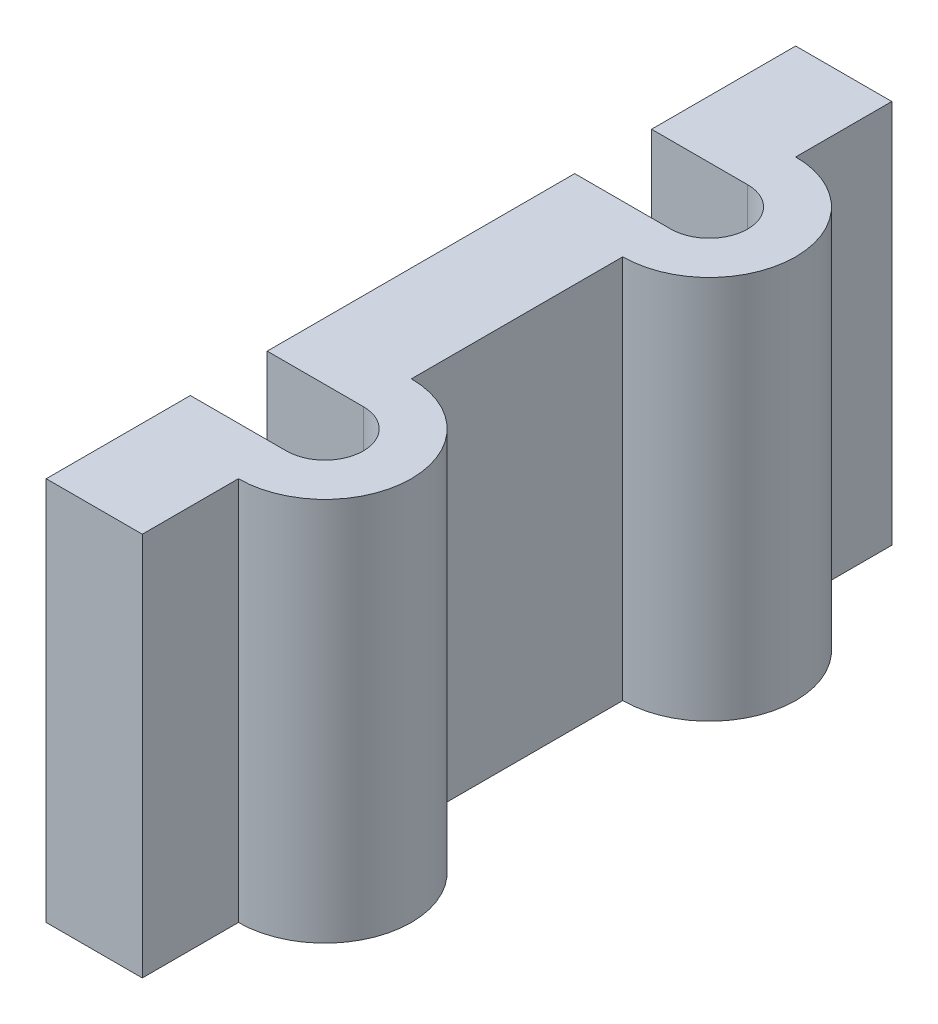
ISO-10303-21;
HEADER;
FILE_DESCRIPTION(('STEP AP214'),'2;1');
FILE_NAME('part.step','',(''),(''),'','','');
FILE_SCHEMA(('AUTOMOTIVE_DESIGN { 1 0 10303 214 1 1 1 1 }'));
ENDSEC;
DATA;
#1=APPLICATION_CONTEXT('core data for automotive mechanical design processes');
#2=APPLICATION_PROTOCOL_DEFINITION('international standard','automotive_design',2000,#1);
#3=PRODUCT_CONTEXT('',#1,'mechanical');
#4=PRODUCT('Part','Part','',(#3));
#5=PRODUCT_RELATED_PRODUCT_CATEGORY('part','',(#4));
#6=PRODUCT_DEFINITION_FORMATION('','',#4);
#7=PRODUCT_DEFINITION_CONTEXT('part definition',#1,'design');
#8=PRODUCT_DEFINITION('design','',#6,#7);
#9=PRODUCT_DEFINITION_SHAPE('','',#8);
#10=(LENGTH_UNIT() NAMED_UNIT(*) SI_UNIT(.MILLI.,.METRE.));
#11=(NAMED_UNIT(*) PLANE_ANGLE_UNIT() SI_UNIT($,.RADIAN.));
#12=(NAMED_UNIT(*) SI_UNIT($,.STERADIAN.) SOLID_ANGLE_UNIT());
#13=UNCERTAINTY_MEASURE_WITH_UNIT(LENGTH_MEASURE(1.E-05),#10,'distance_accuracy_value','');
#14=(GEOMETRIC_REPRESENTATION_CONTEXT(3) GLOBAL_UNCERTAINTY_ASSIGNED_CONTEXT((#13)) GLOBAL_UNIT_ASSIGNED_CONTEXT((#10,
#11,#12)) REPRESENTATION_CONTEXT('',''));
#15=CARTESIAN_POINT('',(0.,0.,0.));
#16=DIRECTION('',(0.,0.,1.));
#17=DIRECTION('',(1.,0.,0.));
#18=AXIS2_PLACEMENT_3D('',#15,#16,#17);
#19=CARTESIAN_POINT('',(0.,40.,0.));
#20=DIRECTION('',(0.,0.,-1.));
#21=DIRECTION('',(-1.,0.,0.));
#22=AXIS2_PLACEMENT_3D('',#19,#20,#21);
#23=PLANE('',#22);
#24=DIRECTION('',(1.,0.,0.));
#25=VECTOR('',#24,1.);
#26=CARTESIAN_POINT('',(0.,0.,0.));
#27=LINE('',#26,#25);
#28=CARTESIAN_POINT('',(0.,0.,0.));
#29=VERTEX_POINT('',#28);
#30=CARTESIAN_POINT('',(10.,0.,0.));
#31=VERTEX_POINT('',#30);
#32=EDGE_CURVE('E179',#29,#31,#27,.T.);
#33=ORIENTED_EDGE('',*,*,#32,.T.);
#34=DIRECTION('',(0.,-1.,0.));
#35=VECTOR('',#34,1.);
#36=CARTESIAN_POINT('',(10.,40.,0.));
#37=LINE('',#36,#35);
#38=CARTESIAN_POINT('',(10.,40.,0.));
#39=VERTEX_POINT('',#38);
#40=EDGE_CURVE('E11',#39,#31,#37,.T.);
#41=ORIENTED_EDGE('',*,*,#40,.F.);
#42=DIRECTION('',(1.,0.,0.));
#43=VECTOR('',#42,1.);
#44=CARTESIAN_POINT('',(0.,40.,0.));
#45=LINE('',#44,#43);
#46=CARTESIAN_POINT('',(0.,40.,0.));
#47=VERTEX_POINT('',#46);
#48=EDGE_CURVE('E209',#47,#39,#45,.T.);
#49=ORIENTED_EDGE('',*,*,#48,.F.);
#50=DIRECTION('',(0.,-1.,0.));
#51=VECTOR('',#50,1.);
#52=CARTESIAN_POINT('',(0.,40.,0.));
#53=LINE('',#52,#51);
#54=EDGE_CURVE('E175',#47,#29,#53,.T.);
#55=ORIENTED_EDGE('',*,*,#54,.T.);
#56=EDGE_LOOP('',(#33,#41,#49,#55));
#57=FACE_BOUND('',#56,.T.);
#58=ADVANCED_FACE('F35',(#57),#23,.F.);
#59=CARTESIAN_POINT('',(10.,40.,0.));
#60=DIRECTION('',(-1.,0.,0.));
#61=DIRECTION('',(0.,0.,1.));
#62=AXIS2_PLACEMENT_3D('',#59,#60,#61);
#63=PLANE('',#62);
#64=DIRECTION('',(0.,0.,-1.));
#65=VECTOR('',#64,1.);
#66=CARTESIAN_POINT('',(10.,0.,0.));
#67=LINE('',#66,#65);
#68=CARTESIAN_POINT('',(10.,0.,-10.));
#69=VERTEX_POINT('',#68);
#70=EDGE_CURVE('E182',#31,#69,#67,.T.);
#71=ORIENTED_EDGE('',*,*,#70,.T.);
#72=DIRECTION('',(0.,-1.,0.));
#73=VECTOR('',#72,1.);
#74=CARTESIAN_POINT('',(10.,40.,-10.));
#75=LINE('',#74,#73);
#76=CARTESIAN_POINT('',(10.,40.,-10.));
#77=VERTEX_POINT('',#76);
#78=EDGE_CURVE('E43',#77,#69,#75,.T.);
#79=ORIENTED_EDGE('',*,*,#78,.F.);
#80=DIRECTION('',(0.,0.,-1.));
#81=VECTOR('',#80,1.);
#82=CARTESIAN_POINT('',(10.,40.,0.));
#83=LINE('',#82,#81);
#84=EDGE_CURVE('E118',#39,#77,#83,.T.);
#85=ORIENTED_EDGE('',*,*,#84,.F.);
#86=ORIENTED_EDGE('',*,*,#40,.T.);
#87=EDGE_LOOP('',(#71,#79,#85,#86));
#88=FACE_BOUND('',#87,.T.);
#89=ADVANCED_FACE('F307',(#88),#63,.F.);
#90=CARTESIAN_POINT('',(10.,40.,-19.));
#91=DIRECTION('',(0.,-1.,0.));
#92=DIRECTION('',(0.,0.,-1.));
#93=AXIS2_PLACEMENT_3D('',#90,#91,#92);
#94=CYLINDRICAL_SURFACE('',#93,9.);
#95=CARTESIAN_POINT('',(10.,0.,-19.));
#96=DIRECTION('',(0.,1.,0.));
#97=DIRECTION('',(0.,0.,1.));
#98=AXIS2_PLACEMENT_3D('',#95,#96,#97);
#99=CIRCLE('',#98,9.);
#100=CARTESIAN_POINT('',(10.,0.,-28.));
#101=VERTEX_POINT('',#100);
#102=EDGE_CURVE('E184',#69,#101,#99,.T.);
#103=ORIENTED_EDGE('',*,*,#102,.T.);
#104=DIRECTION('',(0.,-1.,0.));
#105=VECTOR('',#104,1.);
#106=CARTESIAN_POINT('',(10.,40.,-28.));
#107=LINE('',#106,#105);
#108=CARTESIAN_POINT('',(10.,40.,-28.));
#109=VERTEX_POINT('',#108);
#110=EDGE_CURVE('E240',#109,#101,#107,.T.);
#111=ORIENTED_EDGE('',*,*,#110,.F.);
#112=CARTESIAN_POINT('',(10.,40.,-19.));
#113=DIRECTION('',(0.,1.,0.));
#114=DIRECTION('',(0.,0.,1.));
#115=AXIS2_PLACEMENT_3D('',#112,#113,#114);
#116=CIRCLE('',#115,9.);
#117=EDGE_CURVE('E248',#77,#109,#116,.T.);
#118=ORIENTED_EDGE('',*,*,#117,.F.);
#119=ORIENTED_EDGE('',*,*,#78,.T.);
#120=EDGE_LOOP('',(#103,#111,#118,#119));
#121=FACE_BOUND('',#120,.T.);
#122=ADVANCED_FACE('F246',(#121),#94,.T.);
#123=CARTESIAN_POINT('',(10.,40.,-28.));
#124=DIRECTION('',(-1.,0.,0.));
#125=DIRECTION('',(0.,0.,1.));
#126=AXIS2_PLACEMENT_3D('',#123,#124,#125);
#127=PLANE('',#126);
#128=DIRECTION('',(0.,0.,-1.));
#129=VECTOR('',#128,1.);
#130=CARTESIAN_POINT('',(10.,0.,-28.));
#131=LINE('',#130,#129);
#132=CARTESIAN_POINT('',(9.99999999999999,0.,-50.));
#133=VERTEX_POINT('',#132);
#134=EDGE_CURVE('E186',#101,#133,#131,.T.);
#135=ORIENTED_EDGE('',*,*,#134,.T.);
#136=DIRECTION('',(0.,-1.,0.));
#137=VECTOR('',#136,1.);
#138=CARTESIAN_POINT('',(9.99999999999999,40.,-50.));
#139=LINE('',#138,#137);
#140=CARTESIAN_POINT('',(9.99999999999999,40.,-50.));
#141=VERTEX_POINT('',#140);
#142=EDGE_CURVE('E237',#141,#133,#139,.T.);
#143=ORIENTED_EDGE('',*,*,#142,.F.);
#144=DIRECTION('',(0.,0.,-1.));
#145=VECTOR('',#144,1.);
#146=CARTESIAN_POINT('',(10.,40.,-28.));
#147=LINE('',#146,#145);
#148=EDGE_CURVE('E266',#109,#141,#147,.T.);
#149=ORIENTED_EDGE('',*,*,#148,.F.);
#150=ORIENTED_EDGE('',*,*,#110,.T.);
#151=EDGE_LOOP('',(#135,#143,#149,#150));
#152=FACE_BOUND('',#151,.T.);
#153=ADVANCED_FACE('F257',(#152),#127,.F.);
#154=CARTESIAN_POINT('',(9.99999999999997,40.,-59.));
#155=DIRECTION('',(0.,-1.,0.));
#156=DIRECTION('',(0.,0.,-1.));
#157=AXIS2_PLACEMENT_3D('',#154,#155,#156);
#158=CYLINDRICAL_SURFACE('',#157,9.);
#159=CARTESIAN_POINT('',(9.99999999999997,0.,-59.));
#160=DIRECTION('',(0.,1.,0.));
#161=DIRECTION('',(0.,0.,-1.));
#162=AXIS2_PLACEMENT_3D('',#159,#160,#161);
#163=CIRCLE('',#162,9.);
#164=CARTESIAN_POINT('',(9.99999999999996,0.,-68.));
#165=VERTEX_POINT('',#164);
#166=EDGE_CURVE('E188',#133,#165,#163,.T.);
#167=ORIENTED_EDGE('',*,*,#166,.T.);
#168=DIRECTION('',(0.,-1.,0.));
#169=VECTOR('',#168,1.);
#170=CARTESIAN_POINT('',(9.99999999999996,40.,-68.));
#171=LINE('',#170,#169);
#172=CARTESIAN_POINT('',(9.99999999999996,40.,-68.));
#173=VERTEX_POINT('',#172);
#174=EDGE_CURVE('E234',#173,#165,#171,.T.);
#175=ORIENTED_EDGE('',*,*,#174,.F.);
#176=CARTESIAN_POINT('',(9.99999999999997,40.,-59.));
#177=DIRECTION('',(0.,1.,0.));
#178=DIRECTION('',(0.,0.,-1.));
#179=AXIS2_PLACEMENT_3D('',#176,#177,#178);
#180=CIRCLE('',#179,9.);
#181=EDGE_CURVE('E263',#141,#173,#180,.T.);
#182=ORIENTED_EDGE('',*,*,#181,.F.);
#183=ORIENTED_EDGE('',*,*,#142,.T.);
#184=EDGE_LOOP('',(#167,#175,#182,#183));
#185=FACE_BOUND('',#184,.T.);
#186=ADVANCED_FACE('F261',(#185),#158,.T.);
#187=CARTESIAN_POINT('',(9.99999999999994,40.,-78.));
#188=DIRECTION('',(-1.,0.,0.));
#189=DIRECTION('',(0.,0.,1.));
#190=AXIS2_PLACEMENT_3D('',#187,#188,#189);
#191=PLANE('',#190);
#192=DIRECTION('',(0.,0.,-1.));
#193=VECTOR('',#192,1.);
#194=CARTESIAN_POINT('',(9.99999999999994,0.,-78.));
#195=LINE('',#194,#193);
#196=CARTESIAN_POINT('',(9.99999999999994,0.,-78.));
#197=VERTEX_POINT('',#196);
#198=EDGE_CURVE('E190',#165,#197,#195,.T.);
#199=ORIENTED_EDGE('',*,*,#198,.T.);
#200=DIRECTION('',(0.,-1.,0.));
#201=VECTOR('',#200,1.);
#202=CARTESIAN_POINT('',(9.99999999999994,40.,-78.));
#203=LINE('',#202,#201);
#204=CARTESIAN_POINT('',(9.99999999999994,40.,-78.));
#205=VERTEX_POINT('',#204);
#206=EDGE_CURVE('E231',#205,#197,#203,.T.);
#207=ORIENTED_EDGE('',*,*,#206,.F.);
#208=DIRECTION('',(0.,0.,-1.));
#209=VECTOR('',#208,1.);
#210=CARTESIAN_POINT('',(9.99999999999994,40.,-78.));
#211=LINE('',#210,#209);
#212=EDGE_CURVE('E265',#173,#205,#211,.T.);
#213=ORIENTED_EDGE('',*,*,#212,.F.);
#214=ORIENTED_EDGE('',*,*,#174,.T.);
#215=EDGE_LOOP('',(#199,#207,#213,#214));
#216=FACE_BOUND('',#215,.T.);
#217=ADVANCED_FACE('F320',(#216),#191,.F.);
#218=CARTESIAN_POINT('',(0.,40.,-78.));
#219=DIRECTION('',(0.,0.,1.));
#220=DIRECTION('',(1.,0.,0.));
#221=AXIS2_PLACEMENT_3D('',#218,#219,#220);
#222=PLANE('',#221);
#223=DIRECTION('',(-1.,0.,0.));
#224=VECTOR('',#223,1.);
#225=CARTESIAN_POINT('',(0.,0.,-78.));
#226=LINE('',#225,#224);
#227=CARTESIAN_POINT('',(0.,0.,-78.));
#228=VERTEX_POINT('',#227);
#229=EDGE_CURVE('E192',#197,#228,#226,.T.);
#230=ORIENTED_EDGE('',*,*,#229,.T.);
#231=DIRECTION('',(0.,-1.,0.));
#232=VECTOR('',#231,1.);
#233=CARTESIAN_POINT('',(0.,40.,-78.));
#234=LINE('',#233,#232);
#235=CARTESIAN_POINT('',(0.,40.,-78.));
#236=VERTEX_POINT('',#235);
#237=EDGE_CURVE('E228',#236,#228,#234,.T.);
#238=ORIENTED_EDGE('',*,*,#237,.F.);
#239=DIRECTION('',(-1.,0.,0.));
#240=VECTOR('',#239,1.);
#241=CARTESIAN_POINT('',(0.,40.,-78.));
#242=LINE('',#241,#240);
#243=EDGE_CURVE('E268',#205,#236,#242,.T.);
#244=ORIENTED_EDGE('',*,*,#243,.F.);
#245=ORIENTED_EDGE('',*,*,#206,.T.);
#246=EDGE_LOOP('',(#230,#238,#244,#245));
#247=FACE_BOUND('',#246,.T.);
#248=ADVANCED_FACE('F323',(#247),#222,.F.);
#249=CARTESIAN_POINT('',(0.,40.,-78.));
#250=DIRECTION('',(1.,0.,0.));
#251=DIRECTION('',(0.,0.,-1.));
#252=AXIS2_PLACEMENT_3D('',#249,#250,#251);
#253=PLANE('',#252);
#254=DIRECTION('',(0.,0.,1.));
#255=VECTOR('',#254,1.);
#256=CARTESIAN_POINT('',(0.,0.,-78.));
#257=LINE('',#256,#255);
#258=CARTESIAN_POINT('',(0.,0.,-63.));
#259=VERTEX_POINT('',#258);
#260=EDGE_CURVE('E194',#228,#259,#257,.T.);
#261=ORIENTED_EDGE('',*,*,#260,.T.);
#262=DIRECTION('',(0.,-1.,0.));
#263=VECTOR('',#262,1.);
#264=CARTESIAN_POINT('',(0.,40.,-63.));
#265=LINE('',#264,#263);
#266=CARTESIAN_POINT('',(0.,40.,-63.));
#267=VERTEX_POINT('',#266);
#268=EDGE_CURVE('E225',#267,#259,#265,.T.);
#269=ORIENTED_EDGE('',*,*,#268,.F.);
#270=DIRECTION('',(0.,0.,1.));
#271=VECTOR('',#270,1.);
#272=CARTESIAN_POINT('',(0.,40.,-78.));
#273=LINE('',#272,#271);
#274=EDGE_CURVE('E274',#236,#267,#273,.T.);
#275=ORIENTED_EDGE('',*,*,#274,.F.);
#276=ORIENTED_EDGE('',*,*,#237,.T.);
#277=EDGE_LOOP('',(#261,#269,#275,#276));
#278=FACE_BOUND('',#277,.T.);
#279=ADVANCED_FACE('F327',(#278),#253,.F.);
#280=CARTESIAN_POINT('',(0.,40.,-63.));
#281=DIRECTION('',(0.,0.,-1.));
#282=DIRECTION('',(-1.,0.,0.));
#283=AXIS2_PLACEMENT_3D('',#280,#281,#282);
#284=PLANE('',#283);
#285=DIRECTION('',(1.,0.,0.));
#286=VECTOR('',#285,1.);
#287=CARTESIAN_POINT('',(0.,0.,-63.));
#288=LINE('',#287,#286);
#289=CARTESIAN_POINT('',(10.,0.,-63.));
#290=VERTEX_POINT('',#289);
#291=EDGE_CURVE('E196',#259,#290,#288,.T.);
#292=ORIENTED_EDGE('',*,*,#291,.T.);
#293=DIRECTION('',(0.,-1.,0.));
#294=VECTOR('',#293,1.);
#295=CARTESIAN_POINT('',(10.,40.,-63.));
#296=LINE('',#295,#294);
#297=CARTESIAN_POINT('',(10.,40.,-63.));
#298=VERTEX_POINT('',#297);
#299=EDGE_CURVE('E222',#298,#290,#296,.T.);
#300=ORIENTED_EDGE('',*,*,#299,.F.);
#301=DIRECTION('',(1.,0.,0.));
#302=VECTOR('',#301,1.);
#303=CARTESIAN_POINT('',(0.,40.,-63.));
#304=LINE('',#303,#302);
#305=EDGE_CURVE('E276',#267,#298,#304,.T.);
#306=ORIENTED_EDGE('',*,*,#305,.F.);
#307=ORIENTED_EDGE('',*,*,#268,.T.);
#308=EDGE_LOOP('',(#292,#300,#306,#307));
#309=FACE_BOUND('',#308,.T.);
#310=ADVANCED_FACE('F331',(#309),#284,.F.);
#311=CARTESIAN_POINT('',(9.99999999999997,40.,-59.));
#312=DIRECTION('',(0.,-1.,0.));
#313=DIRECTION('',(0.,0.,-1.));
#314=AXIS2_PLACEMENT_3D('',#311,#312,#313);
#315=CYLINDRICAL_SURFACE('',#314,4.);
#316=CARTESIAN_POINT('',(9.99999999999997,0.,-59.));
#317=DIRECTION('',(0.,-1.,0.));
#318=DIRECTION('',(0.,0.,1.));
#319=AXIS2_PLACEMENT_3D('',#316,#317,#318);
#320=CIRCLE('',#319,4.);
#321=CARTESIAN_POINT('',(9.99999999999998,0.,-55.));
#322=VERTEX_POINT('',#321);
#323=EDGE_CURVE('E198',#290,#322,#320,.T.);
#324=ORIENTED_EDGE('',*,*,#323,.T.);
#325=DIRECTION('',(0.,-1.,0.));
#326=VECTOR('',#325,1.);
#327=CARTESIAN_POINT('',(9.99999999999998,40.,-55.));
#328=LINE('',#327,#326);
#329=CARTESIAN_POINT('',(9.99999999999998,40.,-55.));
#330=VERTEX_POINT('',#329);
#331=EDGE_CURVE('E219',#330,#322,#328,.T.);
#332=ORIENTED_EDGE('',*,*,#331,.F.);
#333=CARTESIAN_POINT('',(9.99999999999997,40.,-59.));
#334=DIRECTION('',(0.,-1.,0.));
#335=DIRECTION('',(0.,0.,1.));
#336=AXIS2_PLACEMENT_3D('',#333,#334,#335);
#337=CIRCLE('',#336,4.);
#338=EDGE_CURVE('E278',#298,#330,#337,.T.);
#339=ORIENTED_EDGE('',*,*,#338,.F.);
#340=ORIENTED_EDGE('',*,*,#299,.T.);
#341=EDGE_LOOP('',(#324,#332,#339,#340));
#342=FACE_BOUND('',#341,.T.);
#343=ADVANCED_FACE('F335',(#342),#315,.F.);
#344=CARTESIAN_POINT('',(0.,40.,-55.));
#345=DIRECTION('',(0.,0.,1.));
#346=DIRECTION('',(1.,0.,0.));
#347=AXIS2_PLACEMENT_3D('',#344,#345,#346);
#348=PLANE('',#347);
#349=DIRECTION('',(-1.,0.,0.));
#350=VECTOR('',#349,1.);
#351=CARTESIAN_POINT('',(0.,0.,-55.));
#352=LINE('',#351,#350);
#353=CARTESIAN_POINT('',(0.,0.,-55.));
#354=VERTEX_POINT('',#353);
#355=EDGE_CURVE('E200',#322,#354,#352,.T.);
#356=ORIENTED_EDGE('',*,*,#355,.T.);
#357=DIRECTION('',(0.,-1.,0.));
#358=VECTOR('',#357,1.);
#359=CARTESIAN_POINT('',(0.,40.,-55.));
#360=LINE('',#359,#358);
#361=CARTESIAN_POINT('',(0.,40.,-55.));
#362=VERTEX_POINT('',#361);
#363=EDGE_CURVE('E216',#362,#354,#360,.T.);
#364=ORIENTED_EDGE('',*,*,#363,.F.);
#365=DIRECTION('',(-1.,0.,0.));
#366=VECTOR('',#365,1.);
#367=CARTESIAN_POINT('',(0.,40.,-55.));
#368=LINE('',#367,#366);
#369=EDGE_CURVE('E280',#330,#362,#368,.T.);
#370=ORIENTED_EDGE('',*,*,#369,.F.);
#371=ORIENTED_EDGE('',*,*,#331,.T.);
#372=EDGE_LOOP('',(#356,#364,#370,#371));
#373=FACE_BOUND('',#372,.T.);
#374=ADVANCED_FACE('F339',(#373),#348,.F.);
#375=CARTESIAN_POINT('',(0.,40.,-23.));
#376=DIRECTION('',(1.,0.,0.));
#377=DIRECTION('',(0.,0.,-1.));
#378=AXIS2_PLACEMENT_3D('',#375,#376,#377);
#379=PLANE('',#378);
#380=DIRECTION('',(0.,0.,1.));
#381=VECTOR('',#380,1.);
#382=CARTESIAN_POINT('',(0.,0.,-23.));
#383=LINE('',#382,#381);
#384=CARTESIAN_POINT('',(0.,0.,-23.));
#385=VERTEX_POINT('',#384);
#386=EDGE_CURVE('E202',#354,#385,#383,.T.);
#387=ORIENTED_EDGE('',*,*,#386,.T.);
#388=DIRECTION('',(0.,-1.,0.));
#389=VECTOR('',#388,1.);
#390=CARTESIAN_POINT('',(0.,40.,-23.));
#391=LINE('',#390,#389);
#392=CARTESIAN_POINT('',(0.,40.,-23.));
#393=VERTEX_POINT('',#392);
#394=EDGE_CURVE('E213',#393,#385,#391,.T.);
#395=ORIENTED_EDGE('',*,*,#394,.F.);
#396=DIRECTION('',(0.,0.,1.));
#397=VECTOR('',#396,1.);
#398=CARTESIAN_POINT('',(0.,40.,-23.));
#399=LINE('',#398,#397);
#400=EDGE_CURVE('E282',#362,#393,#399,.T.);
#401=ORIENTED_EDGE('',*,*,#400,.F.);
#402=ORIENTED_EDGE('',*,*,#363,.T.);
#403=EDGE_LOOP('',(#387,#395,#401,#402));
#404=FACE_BOUND('',#403,.T.);
#405=ADVANCED_FACE('F288',(#404),#379,.F.);
#406=CARTESIAN_POINT('',(0.,40.,-23.));
#407=DIRECTION('',(0.,0.,-1.));
#408=DIRECTION('',(-1.,0.,0.));
#409=AXIS2_PLACEMENT_3D('',#406,#407,#408);
#410=PLANE('',#409);
#411=DIRECTION('',(1.,0.,0.));
#412=VECTOR('',#411,1.);
#413=CARTESIAN_POINT('',(0.,0.,-23.));
#414=LINE('',#413,#412);
#415=CARTESIAN_POINT('',(10.,0.,-23.));
#416=VERTEX_POINT('',#415);
#417=EDGE_CURVE('E204',#385,#416,#414,.T.);
#418=ORIENTED_EDGE('',*,*,#417,.T.);
#419=DIRECTION('',(0.,-1.,0.));
#420=VECTOR('',#419,1.);
#421=CARTESIAN_POINT('',(10.,40.,-23.));
#422=LINE('',#421,#420);
#423=CARTESIAN_POINT('',(10.,40.,-23.));
#424=VERTEX_POINT('',#423);
#425=EDGE_CURVE('E170',#424,#416,#422,.T.);
#426=ORIENTED_EDGE('',*,*,#425,.F.);
#427=DIRECTION('',(1.,0.,0.));
#428=VECTOR('',#427,1.);
#429=CARTESIAN_POINT('',(0.,40.,-23.));
#430=LINE('',#429,#428);
#431=EDGE_CURVE('E161',#393,#424,#430,.T.);
#432=ORIENTED_EDGE('',*,*,#431,.F.);
#433=ORIENTED_EDGE('',*,*,#394,.T.);
#434=EDGE_LOOP('',(#418,#426,#432,#433));
#435=FACE_BOUND('',#434,.T.);
#436=ADVANCED_FACE('F292',(#435),#410,.F.);
#437=CARTESIAN_POINT('',(10.,40.,-19.));
#438=DIRECTION('',(0.,-1.,0.));
#439=DIRECTION('',(0.,0.,-1.));
#440=AXIS2_PLACEMENT_3D('',#437,#438,#439);
#441=CYLINDRICAL_SURFACE('',#440,4.);
#442=CARTESIAN_POINT('',(10.,0.,-19.));
#443=DIRECTION('',(0.,-1.,0.));
#444=DIRECTION('',(0.,0.,-1.));
#445=AXIS2_PLACEMENT_3D('',#442,#443,#444);
#446=CIRCLE('',#445,4.);
#447=CARTESIAN_POINT('',(10.,0.,-15.));
#448=VERTEX_POINT('',#447);
#449=EDGE_CURVE('E169',#416,#448,#446,.T.);
#450=ORIENTED_EDGE('',*,*,#449,.T.);
#451=DIRECTION('',(0.,-1.,0.));
#452=VECTOR('',#451,1.);
#453=CARTESIAN_POINT('',(10.,40.,-15.));
#454=LINE('',#453,#452);
#455=CARTESIAN_POINT('',(10.,40.,-15.));
#456=VERTEX_POINT('',#455);
#457=EDGE_CURVE('E166',#456,#448,#454,.T.);
#458=ORIENTED_EDGE('',*,*,#457,.F.);
#459=CARTESIAN_POINT('',(10.,40.,-19.));
#460=DIRECTION('',(0.,-1.,0.));
#461=DIRECTION('',(0.,0.,-1.));
#462=AXIS2_PLACEMENT_3D('',#459,#460,#461);
#463=CIRCLE('',#462,4.);
#464=EDGE_CURVE('E155',#424,#456,#463,.T.);
#465=ORIENTED_EDGE('',*,*,#464,.F.);
#466=ORIENTED_EDGE('',*,*,#425,.T.);
#467=EDGE_LOOP('',(#450,#458,#465,#466));
#468=FACE_BOUND('',#467,.T.);
#469=ADVANCED_FACE('F167',(#468),#441,.F.);
#470=CARTESIAN_POINT('',(0.,40.,-15.));
#471=DIRECTION('',(0.,0.,1.));
#472=DIRECTION('',(1.,0.,0.));
#473=AXIS2_PLACEMENT_3D('',#470,#471,#472);
#474=PLANE('',#473);
#475=DIRECTION('',(-1.,0.,0.));
#476=VECTOR('',#475,1.);
#477=CARTESIAN_POINT('',(0.,0.,-15.));
#478=LINE('',#477,#476);
#479=CARTESIAN_POINT('',(0.,0.,-15.));
#480=VERTEX_POINT('',#479);
#481=EDGE_CURVE('E104',#448,#480,#478,.T.);
#482=ORIENTED_EDGE('',*,*,#481,.T.);
#483=DIRECTION('',(0.,-1.,0.));
#484=VECTOR('',#483,1.);
#485=CARTESIAN_POINT('',(0.,40.,-15.));
#486=LINE('',#485,#484);
#487=CARTESIAN_POINT('',(0.,40.,-15.));
#488=VERTEX_POINT('',#487);
#489=EDGE_CURVE('E171',#488,#480,#486,.T.);
#490=ORIENTED_EDGE('',*,*,#489,.F.);
#491=DIRECTION('',(-1.,0.,0.));
#492=VECTOR('',#491,1.);
#493=CARTESIAN_POINT('',(0.,40.,-15.));
#494=LINE('',#493,#492);
#495=EDGE_CURVE('E159',#456,#488,#494,.T.);
#496=ORIENTED_EDGE('',*,*,#495,.F.);
#497=ORIENTED_EDGE('',*,*,#457,.T.);
#498=EDGE_LOOP('',(#482,#490,#496,#497));
#499=FACE_BOUND('',#498,.T.);
#500=ADVANCED_FACE('F173',(#499),#474,.F.);
#501=CARTESIAN_POINT('',(0.,40.,0.));
#502=DIRECTION('',(1.,0.,0.));
#503=DIRECTION('',(0.,0.,-1.));
#504=AXIS2_PLACEMENT_3D('',#501,#502,#503);
#505=PLANE('',#504);
#506=DIRECTION('',(0.,0.,1.));
#507=VECTOR('',#506,1.);
#508=CARTESIAN_POINT('',(0.,0.,0.));
#509=LINE('',#508,#507);
#510=EDGE_CURVE('E110',#480,#29,#509,.T.);
#511=ORIENTED_EDGE('',*,*,#510,.T.);
#512=ORIENTED_EDGE('',*,*,#54,.F.);
#513=DIRECTION('',(0.,0.,1.));
#514=VECTOR('',#513,1.);
#515=CARTESIAN_POINT('',(0.,40.,0.));
#516=LINE('',#515,#514);
#517=EDGE_CURVE('E51',#488,#47,#516,.T.);
#518=ORIENTED_EDGE('',*,*,#517,.F.);
#519=ORIENTED_EDGE('',*,*,#489,.T.);
#520=EDGE_LOOP('',(#511,#512,#518,#519));
#521=FACE_BOUND('',#520,.T.);
#522=ADVANCED_FACE('F296',(#521),#505,.F.);
#523=CARTESIAN_POINT('',(10.,40.,-19.));
#524=DIRECTION('',(0.,1.,0.));
#525=DIRECTION('',(0.,0.,1.));
#526=AXIS2_PLACEMENT_3D('',#523,#524,#525);
#527=PLANE('',#526);
#528=ORIENTED_EDGE('',*,*,#48,.T.);
#529=ORIENTED_EDGE('',*,*,#84,.T.);
#530=ORIENTED_EDGE('',*,*,#117,.T.);
#531=ORIENTED_EDGE('',*,*,#148,.T.);
#532=ORIENTED_EDGE('',*,*,#181,.T.);
#533=ORIENTED_EDGE('',*,*,#212,.T.);
#534=ORIENTED_EDGE('',*,*,#243,.T.);
#535=ORIENTED_EDGE('',*,*,#274,.T.);
#536=ORIENTED_EDGE('',*,*,#305,.T.);
#537=ORIENTED_EDGE('',*,*,#338,.T.);
#538=ORIENTED_EDGE('',*,*,#369,.T.);
#539=ORIENTED_EDGE('',*,*,#400,.T.);
#540=ORIENTED_EDGE('',*,*,#431,.T.);
#541=ORIENTED_EDGE('',*,*,#464,.T.);
#542=ORIENTED_EDGE('',*,*,#495,.T.);
#543=ORIENTED_EDGE('',*,*,#517,.T.);
#544=EDGE_LOOP('',(#528,#529,#530,#531,#532,#533,#534,#535,#536,#537,#538,#539,#540,#541,#542,#543));
#545=FACE_BOUND('',#544,.T.);
#546=ADVANCED_FACE('F157',(#545),#527,.T.);
#547=CARTESIAN_POINT('',(10.,0.,-19.));
#548=DIRECTION('',(0.,1.,0.));
#549=DIRECTION('',(0.,0.,1.));
#550=AXIS2_PLACEMENT_3D('',#547,#548,#549);
#551=PLANE('',#550);
#552=ORIENTED_EDGE('',*,*,#32,.F.);
#553=ORIENTED_EDGE('',*,*,#510,.F.);
#554=ORIENTED_EDGE('',*,*,#481,.F.);
#555=ORIENTED_EDGE('',*,*,#449,.F.);
#556=ORIENTED_EDGE('',*,*,#417,.F.);
#557=ORIENTED_EDGE('',*,*,#386,.F.);
#558=ORIENTED_EDGE('',*,*,#355,.F.);
#559=ORIENTED_EDGE('',*,*,#323,.F.);
#560=ORIENTED_EDGE('',*,*,#291,.F.);
#561=ORIENTED_EDGE('',*,*,#260,.F.);
#562=ORIENTED_EDGE('',*,*,#229,.F.);
#563=ORIENTED_EDGE('',*,*,#198,.F.);
#564=ORIENTED_EDGE('',*,*,#166,.F.);
#565=ORIENTED_EDGE('',*,*,#134,.F.);
#566=ORIENTED_EDGE('',*,*,#102,.F.);
#567=ORIENTED_EDGE('',*,*,#70,.F.);
#568=EDGE_LOOP('',(#552,#553,#554,#555,#556,#557,#558,#559,#560,#561,#562,#563,#564,#565,#566,#567));
#569=FACE_BOUND('',#568,.T.);
#570=ADVANCED_FACE('F252',(#569),#551,.F.);
#571=CLOSED_SHELL('',(#58,#89,#122,#153,#186,#217,#248,#279,#310,#343,#374,#405,#436,#469,#500,
#522,#546,#570));
#572=MANIFOLD_SOLID_BREP('B2',#571);
#573=ADVANCED_BREP_SHAPE_REPRESENTATION('',(#18,#572),#14);
#574=SHAPE_DEFINITION_REPRESENTATION(#9,#573);
ENDSEC;
END-ISO-10303-21;
